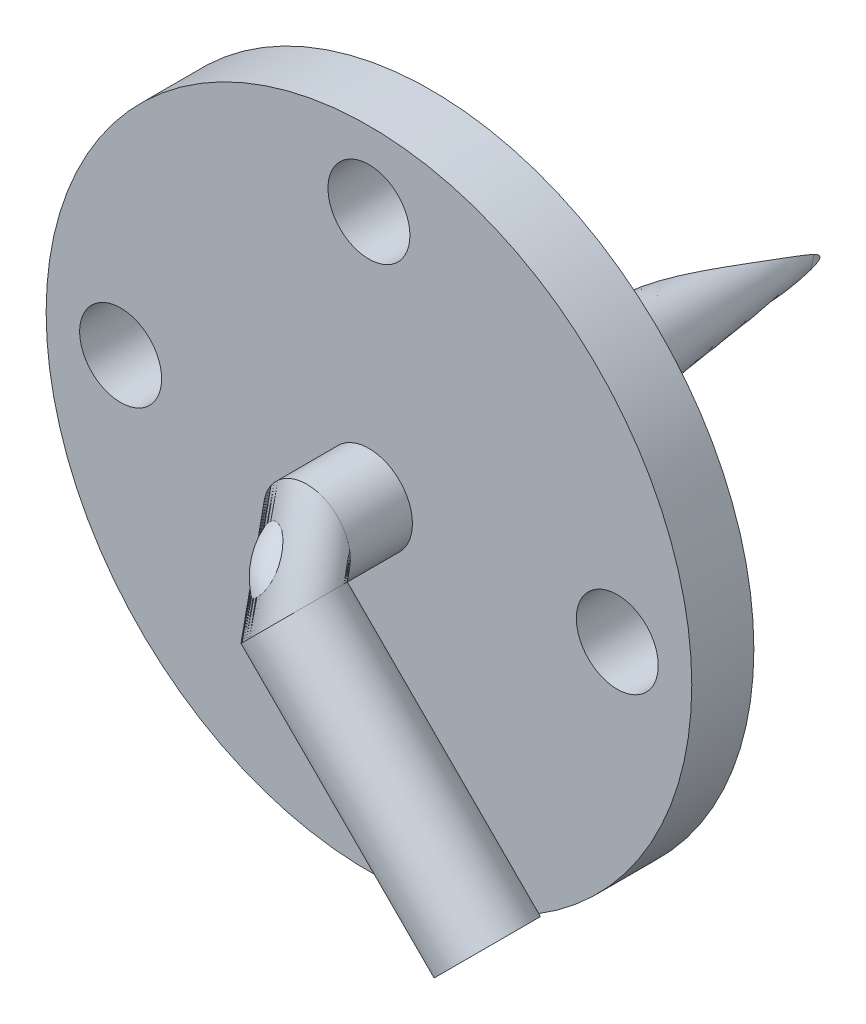
ISO-10303-21;
HEADER;
FILE_DESCRIPTION(('STEP AP214'),'2;1');
FILE_NAME('part.step','',(''),(''),'','','');
FILE_SCHEMA(('AUTOMOTIVE_DESIGN { 1 0 10303 214 1 1 1 1 }'));
ENDSEC;
DATA;
#1=APPLICATION_CONTEXT('core data for automotive mechanical design processes');
#2=APPLICATION_PROTOCOL_DEFINITION('international standard','automotive_design',2000,#1);
#3=PRODUCT_CONTEXT('',#1,'mechanical');
#4=PRODUCT('Part','Part','',(#3));
#5=PRODUCT_RELATED_PRODUCT_CATEGORY('part','',(#4));
#6=PRODUCT_DEFINITION_FORMATION('','',#4);
#7=PRODUCT_DEFINITION_CONTEXT('part definition',#1,'design');
#8=PRODUCT_DEFINITION('design','',#6,#7);
#9=PRODUCT_DEFINITION_SHAPE('','',#8);
#10=(LENGTH_UNIT() NAMED_UNIT(*) SI_UNIT(.MILLI.,.METRE.));
#11=(NAMED_UNIT(*) PLANE_ANGLE_UNIT() SI_UNIT($,.RADIAN.));
#12=(NAMED_UNIT(*) SI_UNIT($,.STERADIAN.) SOLID_ANGLE_UNIT());
#13=UNCERTAINTY_MEASURE_WITH_UNIT(LENGTH_MEASURE(1.E-05),#10,'distance_accuracy_value','');
#14=(GEOMETRIC_REPRESENTATION_CONTEXT(3) GLOBAL_UNCERTAINTY_ASSIGNED_CONTEXT((#13)) GLOBAL_UNIT_ASSIGNED_CONTEXT((#10,
#11,#12)) REPRESENTATION_CONTEXT('',''));
#15=CARTESIAN_POINT('',(0.,0.,0.));
#16=DIRECTION('',(0.,0.,1.));
#17=DIRECTION('',(1.,0.,0.));
#18=AXIS2_PLACEMENT_3D('',#15,#16,#17);
#19=CARTESIAN_POINT('',(0.,0.,2.5));
#20=DIRECTION('',(0.,0.,1.));
#21=DIRECTION('',(1.,0.,0.));
#22=AXIS2_PLACEMENT_3D('',#19,#20,#21);
#23=PLANE('',#22);
#24=CARTESIAN_POINT('',(10.,0.,2.5));
#25=DIRECTION('',(0.,0.,1.));
#26=DIRECTION('',(1.,0.,0.));
#27=AXIS2_PLACEMENT_3D('',#24,#25,#26);
#28=CIRCLE('',#27,1.65);
#29=CARTESIAN_POINT('',(11.65,0.,2.5));
#30=VERTEX_POINT('',#29);
#31=EDGE_CURVE('E66',#30,#30,#28,.T.);
#32=ORIENTED_EDGE('',*,*,#31,.F.);
#33=EDGE_LOOP('',(#32));
#34=FACE_BOUND('',#33,.T.);
#35=CARTESIAN_POINT('',(-10.,0.,2.5));
#36=DIRECTION('',(0.,0.,1.));
#37=DIRECTION('',(1.,0.,0.));
#38=AXIS2_PLACEMENT_3D('',#35,#36,#37);
#39=CIRCLE('',#38,1.65);
#40=CARTESIAN_POINT('',(-8.35,0.,2.5));
#41=VERTEX_POINT('',#40);
#42=EDGE_CURVE('E84',#41,#41,#39,.T.);
#43=ORIENTED_EDGE('',*,*,#42,.F.);
#44=EDGE_LOOP('',(#43));
#45=FACE_BOUND('',#44,.T.);
#46=CARTESIAN_POINT('',(0.,-10.,2.5));
#47=DIRECTION('',(0.,0.,1.));
#48=DIRECTION('',(1.,0.,0.));
#49=AXIS2_PLACEMENT_3D('',#46,#47,#48);
#50=CIRCLE('',#49,1.65);
#51=CARTESIAN_POINT('',(1.65,-10.,2.5));
#52=VERTEX_POINT('',#51);
#53=EDGE_CURVE('E94',#52,#52,#50,.T.);
#54=ORIENTED_EDGE('',*,*,#53,.F.);
#55=EDGE_LOOP('',(#54));
#56=FACE_BOUND('',#55,.T.);
#57=CARTESIAN_POINT('',(0.,0.,2.5));
#58=DIRECTION('',(0.,0.,1.));
#59=DIRECTION('',(1.,0.,0.));
#60=AXIS2_PLACEMENT_3D('',#57,#58,#59);
#61=CIRCLE('',#60,13.);
#62=CARTESIAN_POINT('',(13.,0.,2.5));
#63=VERTEX_POINT('',#62);
#64=EDGE_CURVE('E55',#63,#63,#61,.T.);
#65=ORIENTED_EDGE('',*,*,#64,.T.);
#66=EDGE_LOOP('',(#65));
#67=FACE_BOUND('',#66,.T.);
#68=CARTESIAN_POINT('',(0.,10.,2.5));
#69=DIRECTION('',(0.,0.,1.));
#70=DIRECTION('',(1.,0.,0.));
#71=AXIS2_PLACEMENT_3D('',#68,#69,#70);
#72=CIRCLE('',#71,1.65);
#73=CARTESIAN_POINT('',(1.65,10.,2.5));
#74=VERTEX_POINT('',#73);
#75=EDGE_CURVE('E80',#74,#74,#72,.T.);
#76=ORIENTED_EDGE('',*,*,#75,.F.);
#77=EDGE_LOOP('',(#76));
#78=FACE_BOUND('',#77,.T.);
#79=CARTESIAN_POINT('',(0.,0.,2.5));
#80=DIRECTION('',(0.,0.,1.));
#81=DIRECTION('',(1.,0.,0.));
#82=AXIS2_PLACEMENT_3D('',#79,#80,#81);
#83=CIRCLE('',#82,1.75);
#84=CARTESIAN_POINT('',(1.75,0.,2.5));
#85=VERTEX_POINT('',#84);
#86=EDGE_CURVE('E64',#85,#85,#83,.T.);
#87=ORIENTED_EDGE('',*,*,#86,.F.);
#88=EDGE_LOOP('',(#87));
#89=FACE_BOUND('',#88,.T.);
#90=ADVANCED_FACE('F39',(#34,#45,#56,#67,#78,#89),#23,.T.);
#91=CARTESIAN_POINT('',(0.,0.,0.));
#92=DIRECTION('',(0.,0.,1.));
#93=DIRECTION('',(1.,0.,0.));
#94=AXIS2_PLACEMENT_3D('',#91,#92,#93);
#95=PLANE('',#94);
#96=CARTESIAN_POINT('',(0.,0.,0.));
#97=DIRECTION('',(0.,0.,1.));
#98=DIRECTION('',(1.,0.,0.));
#99=AXIS2_PLACEMENT_3D('',#96,#97,#98);
#100=CIRCLE('',#99,2.5);
#101=CARTESIAN_POINT('',(2.5,0.,0.));
#102=VERTEX_POINT('',#101);
#103=EDGE_CURVE('E11',#102,#102,#100,.F.);
#104=ORIENTED_EDGE('',*,*,#103,.F.);
#105=EDGE_LOOP('',(#104));
#106=FACE_BOUND('',#105,.T.);
#107=CARTESIAN_POINT('',(0.,0.,0.));
#108=DIRECTION('',(0.,0.,1.));
#109=DIRECTION('',(1.,0.,0.));
#110=AXIS2_PLACEMENT_3D('',#107,#108,#109);
#111=CIRCLE('',#110,13.);
#112=CARTESIAN_POINT('',(13.,0.,0.));
#113=VERTEX_POINT('',#112);
#114=EDGE_CURVE('E93',#113,#113,#111,.T.);
#115=ORIENTED_EDGE('',*,*,#114,.F.);
#116=EDGE_LOOP('',(#115));
#117=FACE_BOUND('',#116,.T.);
#118=CARTESIAN_POINT('',(0.,-10.,0.));
#119=DIRECTION('',(0.,0.,1.));
#120=DIRECTION('',(1.,0.,0.));
#121=AXIS2_PLACEMENT_3D('',#118,#119,#120);
#122=CIRCLE('',#121,1.65);
#123=CARTESIAN_POINT('',(1.65,-10.,0.));
#124=VERTEX_POINT('',#123);
#125=EDGE_CURVE('E92',#124,#124,#122,.T.);
#126=ORIENTED_EDGE('',*,*,#125,.T.);
#127=EDGE_LOOP('',(#126));
#128=FACE_BOUND('',#127,.T.);
#129=CARTESIAN_POINT('',(-10.,0.,0.));
#130=DIRECTION('',(0.,0.,1.));
#131=DIRECTION('',(1.,0.,0.));
#132=AXIS2_PLACEMENT_3D('',#129,#130,#131);
#133=CIRCLE('',#132,1.65);
#134=CARTESIAN_POINT('',(-8.35,0.,0.));
#135=VERTEX_POINT('',#134);
#136=EDGE_CURVE('E78',#135,#135,#133,.T.);
#137=ORIENTED_EDGE('',*,*,#136,.T.);
#138=EDGE_LOOP('',(#137));
#139=FACE_BOUND('',#138,.T.);
#140=CARTESIAN_POINT('',(0.,10.,0.));
#141=DIRECTION('',(0.,0.,1.));
#142=DIRECTION('',(1.,0.,0.));
#143=AXIS2_PLACEMENT_3D('',#140,#141,#142);
#144=CIRCLE('',#143,1.65);
#145=CARTESIAN_POINT('',(1.65,10.,0.));
#146=VERTEX_POINT('',#145);
#147=EDGE_CURVE('E73',#146,#146,#144,.T.);
#148=ORIENTED_EDGE('',*,*,#147,.T.);
#149=EDGE_LOOP('',(#148));
#150=FACE_BOUND('',#149,.T.);
#151=CARTESIAN_POINT('',(10.,0.,0.));
#152=DIRECTION('',(0.,0.,1.));
#153=DIRECTION('',(1.,0.,0.));
#154=AXIS2_PLACEMENT_3D('',#151,#152,#153);
#155=CIRCLE('',#154,1.65);
#156=CARTESIAN_POINT('',(11.65,0.,0.));
#157=VERTEX_POINT('',#156);
#158=EDGE_CURVE('E65',#157,#157,#155,.T.);
#159=ORIENTED_EDGE('',*,*,#158,.T.);
#160=EDGE_LOOP('',(#159));
#161=FACE_BOUND('',#160,.T.);
#162=ADVANCED_FACE('F104',(#106,#117,#128,#139,#150,#161),#95,.F.);
#163=CARTESIAN_POINT('',(0.,0.,2.5));
#164=DIRECTION('',(0.,0.,-1.));
#165=DIRECTION('',(-1.,0.,0.));
#166=AXIS2_PLACEMENT_3D('',#163,#164,#165);
#167=CYLINDRICAL_SURFACE('',#166,13.);
#168=ORIENTED_EDGE('',*,*,#64,.F.);
#169=EDGE_LOOP('',(#168));
#170=FACE_BOUND('',#169,.T.);
#171=ORIENTED_EDGE('',*,*,#114,.T.);
#172=EDGE_LOOP('',(#171));
#173=FACE_BOUND('',#172,.T.);
#174=ADVANCED_FACE('F41',(#170,#173),#167,.T.);
#175=CARTESIAN_POINT('',(0.,-10.,2.5));
#176=DIRECTION('',(0.,0.,-1.));
#177=DIRECTION('',(-1.,0.,0.));
#178=AXIS2_PLACEMENT_3D('',#175,#176,#177);
#179=CYLINDRICAL_SURFACE('',#178,1.65);
#180=ORIENTED_EDGE('',*,*,#53,.T.);
#181=EDGE_LOOP('',(#180));
#182=FACE_BOUND('',#181,.T.);
#183=ORIENTED_EDGE('',*,*,#125,.F.);
#184=EDGE_LOOP('',(#183));
#185=FACE_BOUND('',#184,.T.);
#186=ADVANCED_FACE('F138',(#182,#185),#179,.F.);
#187=CARTESIAN_POINT('',(0.,0.,2.5));
#188=DIRECTION('',(0.,0.,-1.));
#189=DIRECTION('',(-1.,0.,0.));
#190=AXIS2_PLACEMENT_3D('',#187,#188,#189);
#191=CYLINDRICAL_SURFACE('',#190,1.);
#192=CARTESIAN_POINT('',(0.,0.,0.));
#193=DIRECTION('',(0.,0.,1.));
#194=DIRECTION('',(1.,0.,0.));
#195=AXIS2_PLACEMENT_3D('',#192,#193,#194);
#196=CIRCLE('',#195,1.);
#197=CARTESIAN_POINT('',(1.,0.,0.));
#198=VERTEX_POINT('',#197);
#199=EDGE_CURVE('E86',#198,#198,#196,.T.);
#200=ORIENTED_EDGE('',*,*,#199,.F.);
#201=EDGE_LOOP('',(#200));
#202=FACE_BOUND('',#201,.T.);
#203=CARTESIAN_POINT('',(0.,0.,5.));
#204=DIRECTION('',(0.,0.,1.));
#205=DIRECTION('',(1.,0.,0.));
#206=AXIS2_PLACEMENT_3D('',#203,#204,#205);
#207=CIRCLE('',#206,1.);
#208=CARTESIAN_POINT('',(-0.707106781186548,0.707106781186548,5.));
#209=VERTEX_POINT('',#208);
#210=EDGE_CURVE('E67',#209,#209,#207,.T.);
#211=ORIENTED_EDGE('',*,*,#210,.T.);
#212=EDGE_LOOP('',(#211));
#213=FACE_BOUND('',#212,.T.);
#214=ADVANCED_FACE('F141',(#202,#213),#191,.F.);
#215=CARTESIAN_POINT('',(-10.,0.,2.5));
#216=DIRECTION('',(0.,0.,-1.));
#217=DIRECTION('',(-1.,0.,0.));
#218=AXIS2_PLACEMENT_3D('',#215,#216,#217);
#219=CYLINDRICAL_SURFACE('',#218,1.65);
#220=ORIENTED_EDGE('',*,*,#42,.T.);
#221=EDGE_LOOP('',(#220));
#222=FACE_BOUND('',#221,.T.);
#223=ORIENTED_EDGE('',*,*,#136,.F.);
#224=EDGE_LOOP('',(#223));
#225=FACE_BOUND('',#224,.T.);
#226=ADVANCED_FACE('F126',(#222,#225),#219,.F.);
#227=CARTESIAN_POINT('',(0.,10.,2.5));
#228=DIRECTION('',(0.,0.,-1.));
#229=DIRECTION('',(-1.,0.,0.));
#230=AXIS2_PLACEMENT_3D('',#227,#228,#229);
#231=CYLINDRICAL_SURFACE('',#230,1.65);
#232=ORIENTED_EDGE('',*,*,#75,.T.);
#233=EDGE_LOOP('',(#232));
#234=FACE_BOUND('',#233,.T.);
#235=ORIENTED_EDGE('',*,*,#147,.F.);
#236=EDGE_LOOP('',(#235));
#237=FACE_BOUND('',#236,.T.);
#238=ADVANCED_FACE('F118',(#234,#237),#231,.F.);
#239=CARTESIAN_POINT('',(10.,0.,2.5));
#240=DIRECTION('',(0.,0.,-1.));
#241=DIRECTION('',(-1.,0.,0.));
#242=AXIS2_PLACEMENT_3D('',#239,#240,#241);
#243=CYLINDRICAL_SURFACE('',#242,1.65);
#244=ORIENTED_EDGE('',*,*,#31,.T.);
#245=EDGE_LOOP('',(#244));
#246=FACE_BOUND('',#245,.T.);
#247=ORIENTED_EDGE('',*,*,#158,.F.);
#248=EDGE_LOOP('',(#247));
#249=FACE_BOUND('',#248,.T.);
#250=ADVANCED_FACE('F116',(#246,#249),#243,.F.);
#251=CARTESIAN_POINT('',(0.,0.,5.));
#252=DIRECTION('',(0.,0.,-1.));
#253=DIRECTION('',(-1.,0.,0.));
#254=AXIS2_PLACEMENT_3D('',#251,#252,#253);
#255=CYLINDRICAL_SURFACE('',#254,1.75);
#256=CARTESIAN_POINT('',(0.,0.,5.));
#257=DIRECTION('',(0.,0.,1.));
#258=DIRECTION('',(1.,0.,0.));
#259=AXIS2_PLACEMENT_3D('',#256,#257,#258);
#260=CIRCLE('',#259,1.75);
#261=CARTESIAN_POINT('',(1.23743686707646,-1.23743686707646,5.));
#262=VERTEX_POINT('',#261);
#263=EDGE_CURVE('E60',#262,#262,#260,.T.);
#264=ORIENTED_EDGE('',*,*,#263,.F.);
#265=EDGE_LOOP('',(#264));
#266=FACE_BOUND('',#265,.T.);
#267=ORIENTED_EDGE('',*,*,#86,.T.);
#268=EDGE_LOOP('',(#267));
#269=FACE_BOUND('',#268,.T.);
#270=ADVANCED_FACE('F117',(#266,#269),#255,.T.);
#271=CARTESIAN_POINT('',(1.23743686707646,-1.23743686707646,5.));
#272=DIRECTION('',(0.707106781186547,0.707106781186548,0.));
#273=DIRECTION('',(-0.707106781186548,0.707106781186547,0.));
#274=AXIS2_PLACEMENT_3D('',#271,#272,#273);
#275=TOROIDAL_SURFACE('',#274,1.75,1.75);
#276=CARTESIAN_POINT('',(1.23743686707646,-1.23743686707646,6.75));
#277=DIRECTION('',(0.707106781186548,-0.707106781186547,0.));
#278=DIRECTION('',(0.5,0.5,-0.707106781186548));
#279=AXIS2_PLACEMENT_3D('',#276,#277,#278);
#280=CIRCLE('',#279,1.75);
#281=EDGE_CURVE('E58',#262,#262,#280,.T.);
#282=ORIENTED_EDGE('',*,*,#281,.F.);
#283=ORIENTED_EDGE('',*,*,#263,.T.);
#284=EDGE_LOOP('',(#282,#283));
#285=FACE_BOUND('',#284,.T.);
#286=ADVANCED_FACE('F59',(#285),#275,.T.);
#287=CARTESIAN_POINT('',(1.23743686707646,-1.23743686707646,6.75));
#288=DIRECTION('',(0.707106781186548,-0.707106781186547,0.));
#289=DIRECTION('',(0.707106781186547,0.707106781186548,0.));
#290=AXIS2_PLACEMENT_3D('',#287,#288,#289);
#291=CYLINDRICAL_SURFACE('',#290,1.75);
#292=ORIENTED_EDGE('',*,*,#281,.T.);
#293=EDGE_LOOP('',(#292));
#294=FACE_BOUND('',#293,.T.);
#295=CARTESIAN_POINT('',(9.01561146012848,-9.01561146012848,6.75));
#296=DIRECTION('',(0.707106781186548,-0.707106781186547,0.));
#297=DIRECTION('',(0.707106781186547,0.707106781186548,0.));
#298=AXIS2_PLACEMENT_3D('',#295,#296,#297);
#299=CIRCLE('',#298,1.75);
#300=CARTESIAN_POINT('',(10.2530483272049,-7.77817459305202,6.75));
#301=VERTEX_POINT('',#300);
#302=EDGE_CURVE('E326',#301,#301,#299,.T.);
#303=ORIENTED_EDGE('',*,*,#302,.F.);
#304=EDGE_LOOP('',(#303));
#305=FACE_BOUND('',#304,.T.);
#306=ADVANCED_FACE('F214',(#294,#305),#291,.T.);
#307=CARTESIAN_POINT('',(1.23743686707646,-1.23743686707646,5.));
#308=DIRECTION('',(0.707106781186547,0.707106781186548,0.));
#309=DIRECTION('',(-0.707106781186548,0.707106781186547,0.));
#310=AXIS2_PLACEMENT_3D('',#307,#308,#309);
#311=TOROIDAL_SURFACE('',#310,1.75,1.);
#312=CARTESIAN_POINT('',(1.23743686707646,-1.23743686707646,6.75));
#313=DIRECTION('',(0.707106781186548,-0.707106781186547,0.));
#314=DIRECTION('',(0.5,0.5,-0.707106781186548));
#315=AXIS2_PLACEMENT_3D('',#312,#313,#314);
#316=CIRCLE('',#315,1.);
#317=CARTESIAN_POINT('',(1.23743686707646,-1.23743686707646,7.75));
#318=VERTEX_POINT('',#317);
#319=EDGE_CURVE('E327',#318,#318,#316,.F.);
#320=CARTESIAN_POINT('',(1.23743686707646,-1.23743686707646,5.));
#321=DIRECTION('',(0.707106781186547,0.707106781186548,0.));
#322=DIRECTION('',(-0.707106781186548,0.707106781186547,0.));
#323=AXIS2_PLACEMENT_3D('',#320,#321,#322);
#324=CIRCLE('',#323,2.75);
#325=EDGE_CURVE('',#209,#318,#324,.T.);
#326=ORIENTED_EDGE('',*,*,#210,.F.);
#327=ORIENTED_EDGE('',*,*,#319,.F.);
#328=ORIENTED_EDGE('',*,*,#325,.T.);
#329=ORIENTED_EDGE('',*,*,#325,.F.);
#330=EDGE_LOOP('',(#326,#328,#327,#329));
#331=FACE_BOUND('',#330,.T.);
#332=ADVANCED_FACE('F224',(#331),#311,.F.);
#333=CARTESIAN_POINT('',(1.23743686707646,-1.23743686707646,6.75));
#334=DIRECTION('',(0.707106781186548,-0.707106781186547,0.));
#335=DIRECTION('',(0.707106781186547,0.707106781186548,0.));
#336=AXIS2_PLACEMENT_3D('',#333,#334,#335);
#337=CYLINDRICAL_SURFACE('',#336,1.);
#338=ORIENTED_EDGE('',*,*,#319,.T.);
#339=EDGE_LOOP('',(#338));
#340=FACE_BOUND('',#339,.T.);
#341=CARTESIAN_POINT('',(9.01561146012848,-9.01561146012848,6.75));
#342=DIRECTION('',(0.707106781186548,-0.707106781186547,0.));
#343=DIRECTION('',(0.707106781186547,0.707106781186548,0.));
#344=AXIS2_PLACEMENT_3D('',#341,#342,#343);
#345=CIRCLE('',#344,1.);
#346=CARTESIAN_POINT('',(9.72271824131503,-8.30850467894193,6.75));
#347=VERTEX_POINT('',#346);
#348=EDGE_CURVE('E324',#347,#347,#345,.T.);
#349=ORIENTED_EDGE('',*,*,#348,.T.);
#350=EDGE_LOOP('',(#349));
#351=FACE_BOUND('',#350,.T.);
#352=ADVANCED_FACE('F129',(#340,#351),#337,.F.);
#353=CARTESIAN_POINT('',(9.01561146012848,-9.01561146012848,6.75));
#354=DIRECTION('',(0.707106781186548,-0.707106781186547,0.));
#355=DIRECTION('',(0.707106781186547,0.707106781186548,0.));
#356=AXIS2_PLACEMENT_3D('',#353,#354,#355);
#357=PLANE('',#356);
#358=ORIENTED_EDGE('',*,*,#302,.T.);
#359=EDGE_LOOP('',(#358));
#360=FACE_BOUND('',#359,.T.);
#361=ORIENTED_EDGE('',*,*,#348,.F.);
#362=EDGE_LOOP('',(#361));
#363=FACE_BOUND('',#362,.T.);
#364=ADVANCED_FACE('F213',(#360,#363),#357,.T.);
#365=CARTESIAN_POINT('',(0.,0.,0.));
#366=DIRECTION('',(0.,0.,-1.));
#367=DIRECTION('',(-1.,0.,0.));
#368=AXIS2_PLACEMENT_3D('',#365,#366,#367);
#369=PLANE('',#368);
#370=CARTESIAN_POINT('',(0.,0.,0.));
#371=DIRECTION('',(0.,0.,-1.));
#372=DIRECTION('',(-1.,0.,0.));
#373=AXIS2_PLACEMENT_3D('',#370,#371,#372);
#374=CIRCLE('',#373,0.5);
#375=CARTESIAN_POINT('',(-0.5,0.,0.));
#376=VERTEX_POINT('',#375);
#377=EDGE_CURVE('E316',#376,#376,#374,.T.);
#378=ORIENTED_EDGE('',*,*,#377,.T.);
#379=EDGE_LOOP('',(#378));
#380=FACE_BOUND('',#379,.T.);
#381=ORIENTED_EDGE('',*,*,#199,.T.);
#382=EDGE_LOOP('',(#381));
#383=FACE_BOUND('',#382,.T.);
#384=ADVANCED_FACE('F248',(#380,#383),#369,.F.);
#385=CARTESIAN_POINT('',(0.,0.,0.));
#386=DIRECTION('',(0.,0.,1.));
#387=DIRECTION('',(-1.,0.,0.));
#388=AXIS2_PLACEMENT_3D('',#385,#386,#387);
#389=CONICAL_SURFACE('',#388,2.5,0.122173047639603);
#390=CARTESIAN_POINT('',(0.650387906013212,-0.261293150512693,-14.6523906522866));
#391=CARTESIAN_POINT('',(0.651309016383526,-0.251019470734047,-14.6765999202653));
#392=CARTESIAN_POINT('',(0.652146807185103,-0.240450651162205,-14.7006877978996));
#393=CARTESIAN_POINT('',(0.653659033565699,-0.21843687886842,-14.7485314101537));
#394=CARTESIAN_POINT('',(0.654333143237079,-0.206990236942591,-14.7722863947996));
#395=CARTESIAN_POINT('',(0.655512823742619,-0.182938777542622,-14.8189483161456));
#396=CARTESIAN_POINT('',(0.656019779189036,-0.170344637924219,-14.8418607470382));
#397=CARTESIAN_POINT('',(0.656874935486865,-0.143208343787394,-14.8864877573539));
#398=CARTESIAN_POINT('',(0.657223728072893,-0.128673718021874,-14.9082065299037));
#399=CARTESIAN_POINT('',(0.657621135729844,-0.104803634988457,-14.9377067362055));
#400=CARTESIAN_POINT('',(0.65772989791494,-0.0969316436804664,-14.9466513886908));
#401=CARTESIAN_POINT('',(0.657915970052388,-0.0800948873669221,-14.9634418557019));
#402=CARTESIAN_POINT('',(0.657993413339822,-0.0711349707011022,-14.9712922332429));
#403=CARTESIAN_POINT('',(0.658085966079111,-0.0566186944127039,-14.9815264849003));
#404=CARTESIAN_POINT('',(0.658112854468826,-0.0516104606362154,-14.9846767453726));
#405=CARTESIAN_POINT('',(0.658158708354126,-0.0412029886975293,-14.9902665099768));
#406=CARTESIAN_POINT('',(0.658177675845747,-0.0358038494449176,-14.9927061931244));
#407=CARTESIAN_POINT('',(0.658207571781146,-0.0245745052499262,-14.9966570720991));
#408=CARTESIAN_POINT('',(0.658218378882825,-0.0187391598920174,-14.9981542002416));
#409=CARTESIAN_POINT('',(0.658231101220235,-0.0068887536743733,-14.9999258664716));
#410=CARTESIAN_POINT('',(0.658233035141072,-0.000874097332935209,-15.0002029736243));
#411=CARTESIAN_POINT('',(0.658228361348984,0.0101703264853276,-14.9995465090122));
#412=CARTESIAN_POINT('',(0.65822299917715,0.0152116877027437,-14.9987894101607));
#413=CARTESIAN_POINT('',(0.658206009559098,0.0251038620739108,-14.9964622599377));
#414=CARTESIAN_POINT('',(0.658194374119505,0.0299544236323272,-14.9948911714835));
#415=CARTESIAN_POINT('',(0.658158130009014,0.0416087517704876,-14.9901944972787));
#416=CARTESIAN_POINT('',(0.658129991558814,0.0482556364164764,-14.9866852528373));
#417=CARTESIAN_POINT('',(0.658061145571779,0.0609390805887943,-14.9787033998282));
#418=CARTESIAN_POINT('',(0.658020403220784,0.0669738873705726,-14.9742281334186));
#419=CARTESIAN_POINT('',(0.657854218295116,0.0874068357315273,-14.9573134484545));
#420=CARTESIAN_POINT('',(0.657694882793086,0.100392219559889,-14.9432114797376));
#421=CARTESIAN_POINT('',(0.657294423327989,0.124409029223051,-14.913423642597));
#422=CARTESIAN_POINT('',(0.657052692534431,0.135425005529452,-14.89772664704));
#423=CARTESIAN_POINT('',(0.656167811933674,0.167861776021744,-14.8475813800058));
#424=CARTESIAN_POINT('',(0.655377897212508,0.187158674350497,-14.8117746995833));
#425=CARTESIAN_POINT('',(0.653406461010012,0.223272013169114,-14.738924354305));
#426=CARTESIAN_POINT('',(0.652223730784884,0.24008056296862,-14.7018771927227));
#427=CARTESIAN_POINT('',(0.64945905166448,0.272188330392317,-14.6270889071903));
#428=CARTESIAN_POINT('',(0.647876655740964,0.287485831069207,-14.5893470503379));
#429=CARTESIAN_POINT('',(0.644312637184248,0.317055428355377,-14.5135584686077));
#430=CARTESIAN_POINT('',(0.642331623617928,0.331329044810185,-14.4755122928603));
#431=CARTESIAN_POINT('',(0.635814799851519,0.372898054714668,-14.3615642630053));
#432=CARTESIAN_POINT('',(0.630685637730932,0.399159031235134,-14.285318012336));
#433=CARTESIAN_POINT('',(0.618829458926739,0.449994466242684,-14.1323856745658));
#434=CARTESIAN_POINT('',(0.612102140739253,0.474568605366569,-14.0556995071386));
#435=CARTESIAN_POINT('',(0.589504385026746,0.546493649636655,-13.8251402971434));
#436=CARTESIAN_POINT('',(0.571226729298554,0.591994749126183,-13.6709180432794));
#437=CARTESIAN_POINT('',(0.528283838668413,0.67920259839586,-13.3623356027525));
#438=CARTESIAN_POINT('',(0.503619812213623,0.720910064002793,-13.2079754476843));
#439=CARTESIAN_POINT('',(0.447968052501731,0.800400940877686,-12.8994614031886));
#440=CARTESIAN_POINT('',(0.416983102825132,0.838186068433936,-12.7453074529286));
#441=CARTESIAN_POINT('',(0.329856903129577,0.929084495268066,-12.3520637375853));
#442=CARTESIAN_POINT('',(0.269287071654263,0.979097856801279,-12.1132152946747));
#443=CARTESIAN_POINT('',(0.133371285525503,1.06548691112175,-11.6368623306773));
#444=CARTESIAN_POINT('',(0.0580087132332364,1.10184713139628,-11.3993596329453));
#445=CARTESIAN_POINT('',(-0.0655226926030483,1.14268292265503,-11.0450951437523));
#446=CARTESIAN_POINT('',(-0.108473680555814,1.15401316378588,-10.9272757394769));
#447=CARTESIAN_POINT('',(-0.197720282443655,1.17133651410907,-10.6925244897944));
#448=CARTESIAN_POINT('',(-0.244015180588394,1.17733076187397,-10.5755924603251));
#449=CARTESIAN_POINT('',(-0.33967404944516,1.18308331754255,-10.3430684118314));
#450=CARTESIAN_POINT('',(-0.389032352587538,1.18285281774017,-10.2274743615677));
#451=CARTESIAN_POINT('',(-0.490597090297115,1.17506094530101,-9.99782385772651));
#452=CARTESIAN_POINT('',(-0.542802241324041,1.16750285103822,-9.88376673966075));
#453=CARTESIAN_POINT('',(-0.643048536224046,1.14507968984862,-9.67169268278067));
#454=CARTESIAN_POINT('',(-0.690806169463315,1.13123390718982,-9.57343652222805));
#455=CARTESIAN_POINT('',(-0.787821554909635,1.09547716762174,-9.37898603132608));
#456=CARTESIAN_POINT('',(-0.837080687575383,1.07355857015082,-9.28279374591409));
#457=CARTESIAN_POINT('',(-0.935938772350111,1.02014380028781,-9.09433733634352));
#458=CARTESIAN_POINT('',(-0.985531249335126,0.988730854695367,-9.00204671888797));
#459=CARTESIAN_POINT('',(-1.08425204514736,0.913960251866891,-8.82228397209314));
#460=CARTESIAN_POINT('',(-1.13338123198842,0.870633655589436,-8.7348000130028));
#461=CARTESIAN_POINT('',(-1.21432537007848,0.784428448352952,-8.59337871802777));
#462=CARTESIAN_POINT('',(-1.24680676888463,0.745533624738107,-8.53741712923709));
#463=CARTESIAN_POINT('',(-1.30926312357224,0.658982939237969,-8.43106640644261));
#464=CARTESIAN_POINT('',(-1.33924257682533,0.611343312505602,-8.38066721873512));
#465=CARTESIAN_POINT('',(-1.38490151062152,0.524286427080609,-8.30463831071151));
#466=CARTESIAN_POINT('',(-1.40192434395454,0.487786262150126,-8.27649613691174));
#467=CARTESIAN_POINT('',(-1.43307996711635,0.410252010503865,-8.2252558022762));
#468=CARTESIAN_POINT('',(-1.44721660843706,0.369224080089959,-8.20215091657569));
#469=CARTESIAN_POINT('',(-1.46908124415488,0.291412705856396,-8.16654716498059));
#470=CARTESIAN_POINT('',(-1.47752288351397,0.255382106629539,-8.15285600179217));
#471=CARTESIAN_POINT('',(-1.49117916261805,0.181146224260535,-8.1307487769891));
#472=CARTESIAN_POINT('',(-1.49639679643275,0.142942994919654,-8.12232782094443));
#473=CARTESIAN_POINT('',(-1.50313757587494,0.0651244258958922,-8.11145446854293));
#474=CARTESIAN_POINT('',(-1.50463900238665,0.0255021513469285,-8.10903715980603));
#475=CARTESIAN_POINT('',(-1.50371878330817,-0.0535783415055934,-8.11051999594697));
#476=CARTESIAN_POINT('',(-1.50129701966295,-0.093036554836467,-8.11442033093276));
#477=CARTESIAN_POINT('',(-1.49316811801867,-0.167059122969179,-8.1275411401092));
#478=CARTESIAN_POINT('',(-1.48776806812217,-0.201749001649764,-8.13626449849974));
#479=CARTESIAN_POINT('',(-1.4743415179279,-0.269197420776583,-8.15801638308727));
#480=CARTESIAN_POINT('',(-1.46631401444384,-0.301955217889129,-8.17104655368405));
#481=CARTESIAN_POINT('',(-1.44371178846385,-0.380434777655768,-8.20787003160349));
#482=CARTESIAN_POINT('',(-1.4278478595702,-0.424770353086465,-8.233821576222));
#483=CARTESIAN_POINT('',(-1.3928486418984,-0.50807593074365,-8.29148237061255));
#484=CARTESIAN_POINT('',(-1.37370517657926,-0.54703207157783,-8.32320602398754));
#485=CARTESIAN_POINT('',(-1.32120508872078,-0.641630369449194,-8.41091783577854));
#486=CARTESIAN_POINT('',(-1.28618201310762,-0.69336391793295,-8.47009176723839));
#487=CARTESIAN_POINT('',(-1.21348988164656,-0.786130807695057,-8.59478236430187));
#488=CARTESIAN_POINT('',(-1.17581446344769,-0.827137224573634,-8.66031443442266));
#489=CARTESIAN_POINT('',(-1.10236480611031,-0.897494437029448,-8.79018642554416));
#490=CARTESIAN_POINT('',(-1.06667098582318,-0.92750421678762,-8.85422178760056));
#491=CARTESIAN_POINT('',(-0.995058171886101,-0.981259909280764,-8.98478439799663));
#492=CARTESIAN_POINT('',(-0.959139012239458,-1.00500046113873,-9.05131372379945));
#493=CARTESIAN_POINT('',(-0.887536584556996,-1.0471499097541,-9.18622179168705));
#494=CARTESIAN_POINT('',(-0.851853554715637,-1.06555404612998,-9.25460212589598));
#495=CARTESIAN_POINT('',(-0.78105547081754,-1.09774055357765,-9.39274265654153));
#496=CARTESIAN_POINT('',(-0.745940631283894,-1.11152121607731,-9.46250335301863));
#497=CARTESIAN_POINT('',(-0.643155979712761,-1.14636769014609,-9.67062378860226));
#498=CARTESIAN_POINT('',(-0.57661476785983,-1.16171624357207,-9.81051053395141));
#499=CARTESIAN_POINT('',(-0.447627552840704,-1.18026096784588,-10.0930078053753));
#500=CARTESIAN_POINT('',(-0.385185969123342,-1.18344422910217,-10.2356210636362));
#501=CARTESIAN_POINT('',(-0.264823329792375,-1.1799337945431,-10.523210263678));
#502=CARTESIAN_POINT('',(-0.20691975478357,-1.17320370950521,-10.668192968664));
#503=CARTESIAN_POINT('',(-0.09632080549865,-1.15157057305531,-10.9593794250015));
#504=CARTESIAN_POINT('',(-0.0436217091142248,-1.13667341321419,-11.1055822214207));
#505=CARTESIAN_POINT('',(0.0541370830958068,-1.10089228755892,-11.3924477095338));
#506=CARTESIAN_POINT('',(0.0994322102353932,-1.08030382696679,-11.5330678340193));
#507=CARTESIAN_POINT('',(0.184920409293975,-1.03387808415988,-11.8149930786957));
#508=CARTESIAN_POINT('',(0.225113129112026,-1.00804044003517,-11.9562982454613));
#509=CARTESIAN_POINT('',(0.300382736486898,-0.951823812017219,-12.2398068518792));
#510=CARTESIAN_POINT('',(0.335444736808649,-0.921432111082135,-12.38201170352));
#511=CARTESIAN_POINT('',(0.400220013609528,-0.856803610540435,-12.6667199680805));
#512=CARTESIAN_POINT('',(0.42993471677455,-0.822567840521387,-12.8092232910711));
#513=CARTESIAN_POINT('',(0.484003472988701,-0.750635000648714,-13.0946092432913));
#514=CARTESIAN_POINT('',(0.508349241573271,-0.712932707076875,-13.2374921191361));
#515=CARTESIAN_POINT('',(0.551592686197799,-0.634271506811041,-13.5233096281905));
#516=CARTESIAN_POINT('',(0.570486342044053,-0.593310225301824,-13.6662442221749));
#517=CARTESIAN_POINT('',(0.594666246408796,-0.529187012382629,-13.8799525207254));
#518=CARTESIAN_POINT('',(0.602021077407472,-0.507416820070782,-13.9509168133252));
#519=CARTESIAN_POINT('',(0.615369868329885,-0.462750057718416,-14.0926430995504));
#520=CARTESIAN_POINT('',(0.621363483379297,-0.439853204013495,-14.1634050374339));
#521=CARTESIAN_POINT('',(0.631981837133657,-0.392563616359544,-14.3044217119074));
#522=CARTESIAN_POINT('',(0.636608405962694,-0.3681729355924,-14.3746770026326));
#523=CARTESIAN_POINT('',(0.644507820750371,-0.317072742210311,-14.5144087960549));
#524=CARTESIAN_POINT('',(0.647781441348632,-0.290364567121664,-14.5838857221768));
#525=CARTESIAN_POINT('',(0.650387906013212,-0.261293150512693,-14.6523906522866));
#526=B_SPLINE_CURVE_WITH_KNOTS('',3,(#390,#391,#392,#393,#394,#395,#396,#397,#398,#399,#400,
#401,#402,#403,#404,#405,#406,#407,#408,#409,#410,#411,#412,#413,#414,#415,#416,#417,#418,#419,
#420,#421,#422,#423,#424,#425,#426,#427,#428,#429,#430,#431,#432,#433,#434,#435,#436,#437,#438,
#439,#440,#441,#442,#443,#444,#445,#446,#447,#448,#449,#450,#451,#452,#453,#454,#455,#456,#457,
#458,#459,#460,#461,#462,#463,#464,#465,#466,#467,#468,#469,#470,#471,#472,#473,#474,#475,#476,
#477,#478,#479,#480,#481,#482,#483,#484,#485,#486,#487,#488,#489,#490,#491,#492,#493,#494,#495,
#496,#497,#498,#499,#500,#501,#502,#503,#504,#505,#506,#507,#508,#509,#510,#511,#512,#513,#514,
#515,#516,#517,#518,#519,#520,#521,#522,#523,#524,#525),.UNSPECIFIED.,.T.,.F.,(4,2,2,2,2,2,2,2,
2,2,2,2,2,2,2,2,2,2,2,2,2,2,2,2,2,2,2,2,2,2,2,2,2,2,2,2,2,2,2,2,2,2,2,2,2,2,2,2,2,2,2,2,2,2,2,2,
2,2,2,2,2,2,2,2,2,2,2,4),(0.,0.0789441705660483,0.158044262105403,0.236471631948048,
0.314603110355121,0.350301117986312,0.385845505456323,0.403554388885664,0.42125880704667,
0.439221563197492,0.457146476039877,0.472365065551549,0.48760309252093,0.51002281805761,
0.532505032205212,0.58956614624654,0.647056928930484,0.768771249155179,0.890863624663962,
1.01309317063882,1.13513735537883,1.37749399543608,1.61989639421438,2.10518225316199,
2.59037635196452,3.07535724257951,3.82892403757978,4.58334225811198,4.96095779586247,
5.3384927402188,5.71534891001851,6.09203655171441,6.42213777826974,6.75255223725059,
7.08015041016539,7.40690244611858,7.63287011330229,7.85842242733803,8.00540002042409,
8.15218017781647,8.27008463198797,8.38787942542574,8.50636105372607,8.62484624739325,
8.73292961467035,8.84105429741819,9.00143645970641,9.16222446646116,9.41892654086753,
9.67626686943044,9.91356746812108,10.1510703325257,10.3887844155336,10.6265862475926,
11.0928110208832,11.5595304064471,12.0279672680373,12.4960666520747,12.9433617171344,
13.3906876318487,13.8392868057554,14.2877661131074,14.7369326723529,15.1864295896338,
15.4101903245553,15.6340076878598,15.8575240452675,16.0809122489904),.UNSPECIFIED.);
#527=CARTESIAN_POINT('',(0.650387906013212,-0.261293150512693,-14.6523906522866));
#528=VERTEX_POINT('',#527);
#529=EDGE_CURVE('E312',#528,#528,#526,.T.);
#530=ORIENTED_EDGE('',*,*,#529,.T.);
#531=EDGE_LOOP('',(#530));
#532=FACE_BOUND('',#531,.T.);
#533=ORIENTED_EDGE('',*,*,#103,.T.);
#534=EDGE_LOOP('',(#533));
#535=FACE_BOUND('',#534,.T.);
#536=ADVANCED_FACE('F259',(#532,#535),#389,.T.);
#537=CARTESIAN_POINT('',(0.,0.,0.));
#538=DIRECTION('',(0.,0.,-1.));
#539=DIRECTION('',(-1.,0.,0.));
#540=AXIS2_PLACEMENT_3D('',#537,#538,#539);
#541=CYLINDRICAL_SURFACE('',#540,0.5);
#542=CARTESIAN_POINT('',(0.494193805472367,-0.0759768559040746,-13.0192281128357));
#543=CARTESIAN_POINT('',(0.492629708568651,-0.0861561584868214,-13.0102261859376));
#544=CARTESIAN_POINT('',(0.490886111442513,-0.0954472020562682,-13.0002544031024));
#545=CARTESIAN_POINT('',(0.487192583381336,-0.112788382091349,-12.9793063623275));
#546=CARTESIAN_POINT('',(0.485241771318463,-0.120832830080348,-12.9683258440818));
#547=CARTESIAN_POINT('',(0.479128482143801,-0.143853695411301,-12.934213111338));
#548=CARTESIAN_POINT('',(0.474754810338143,-0.157450608549134,-12.9101976820148));
#549=CARTESIAN_POINT('',(0.466071132460029,-0.18144281680396,-12.8633714184473));
#550=CARTESIAN_POINT('',(0.461789039243475,-0.192014149416475,-12.8406390403642));
#551=CARTESIAN_POINT('',(0.452991901235333,-0.211936133340659,-12.7946837367281));
#552=CARTESIAN_POINT('',(0.448476821729076,-0.221286602008131,-12.7714607383795));
#553=CARTESIAN_POINT('',(0.434602525558077,-0.248048395782895,-12.7012223058054));
#554=CARTESIAN_POINT('',(0.424937000055513,-0.264112347514501,-12.6537605088099));
#555=CARTESIAN_POINT('',(0.404926234437393,-0.293854541594889,-12.5584648330131));
#556=CARTESIAN_POINT('',(0.39458370518795,-0.307541582742975,-12.510633042175));
#557=CARTESIAN_POINT('',(0.373236793298462,-0.333123449276927,-12.4147210538283));
#558=CARTESIAN_POINT('',(0.362233406293154,-0.345020880557452,-12.3666413250402));
#559=CARTESIAN_POINT('',(0.334188673311765,-0.372651697788911,-12.247410981029));
#560=CARTESIAN_POINT('',(0.316762223645318,-0.387522317899457,-12.1761511560934));
#561=CARTESIAN_POINT('',(0.280523039282202,-0.414506555658615,-12.0334514538305));
#562=CARTESIAN_POINT('',(0.261710006579081,-0.426619578339668,-11.9620115410036));
#563=CARTESIAN_POINT('',(0.22269047942244,-0.448226791595285,-11.8189513443158));
#564=CARTESIAN_POINT('',(0.202481142084418,-0.457715430056419,-11.7473309966875));
#565=CARTESIAN_POINT('',(0.16073666580276,-0.473988828022036,-11.604169891543));
#566=CARTESIAN_POINT('',(0.139201553633683,-0.480773642110677,-11.5326291324491));
#567=CARTESIAN_POINT('',(0.0949302528621901,-0.491431225581527,-11.3900082144638));
#568=CARTESIAN_POINT('',(0.0721990974314929,-0.495315293471454,-11.3189273489083));
#569=CARTESIAN_POINT('',(0.0255141147315901,-0.499899320634941,-11.1770762990267));
#570=CARTESIAN_POINT('',(0.00156056404427143,-0.500599996987992,-11.1063060483212));
#571=CARTESIAN_POINT('',(-0.0474438428057442,-0.498346811864953,-10.9653786402079));
#572=CARTESIAN_POINT('',(-0.0724920882374667,-0.495401231731852,-10.8952204566179));
#573=CARTESIAN_POINT('',(-0.123614119225562,-0.485181428251557,-10.7556130031991));
#574=CARTESIAN_POINT('',(-0.149687295034468,-0.477909743237875,-10.6861633419323));
#575=CARTESIAN_POINT('',(-0.188753516701033,-0.463196927570717,-10.58454324464));
#576=CARTESIAN_POINT('',(-0.201427317152159,-0.457848956492674,-10.5519430153503));
#577=CARTESIAN_POINT('',(-0.226930355850713,-0.445760308949636,-10.4870521046038));
#578=CARTESIAN_POINT('',(-0.239759621726901,-0.439019381412412,-10.4547614800509));
#579=CARTESIAN_POINT('',(-0.265514134776145,-0.42393973186665,-10.390616681199));
#580=CARTESIAN_POINT('',(-0.278439310922209,-0.415602097030523,-10.3587622256422));
#581=CARTESIAN_POINT('',(-0.304318200971637,-0.397044002567007,-10.2956248855293));
#582=CARTESIAN_POINT('',(-0.317271903227587,-0.386824206759279,-10.2643418037176));
#583=CARTESIAN_POINT('',(-0.34564206674205,-0.361879358827556,-10.1964876026495));
#584=CARTESIAN_POINT('',(-0.361041710640923,-0.346663526252349,-10.1600868347376));
#585=CARTESIAN_POINT('',(-0.391391071044182,-0.312005507946243,-10.0891216378883));
#586=CARTESIAN_POINT('',(-0.406341414457879,-0.292569555097515,-10.0545545933485));
#587=CARTESIAN_POINT('',(-0.428748096493709,-0.257671706827358,-10.0032418532661));
#588=CARTESIAN_POINT('',(-0.436615396288618,-0.244205479414495,-9.98532918011153));
#589=CARTESIAN_POINT('',(-0.451712786165944,-0.215003668174356,-9.95112392238438));
#590=CARTESIAN_POINT('',(-0.458943455030126,-0.199270180634098,-9.93482986451082));
#591=CARTESIAN_POINT('',(-0.470410366076393,-0.169957836073987,-9.90909677121762));
#592=CARTESIAN_POINT('',(-0.474912634357402,-0.157043311697709,-9.89902769989268));
#593=CARTESIAN_POINT('',(-0.483094994824014,-0.129699404768065,-9.88077333685096));
#594=CARTESIAN_POINT('',(-0.486776623030312,-0.115272927914414,-9.87258452490666));
#595=CARTESIAN_POINT('',(-0.492192274628998,-0.0887737761055597,-9.86055929402267));
#596=CARTESIAN_POINT('',(-0.494183186746364,-0.0770185033996947,-9.85614636135971));
#597=CARTESIAN_POINT('',(-0.497345417785681,-0.0528700164850477,-9.84914260604359));
#598=CARTESIAN_POINT('',(-0.498517662506727,-0.0404775399549258,-9.84654972514772));
#599=CARTESIAN_POINT('',(-0.499925585289154,-0.0152995476243637,-9.8434360318977));
#600=CARTESIAN_POINT('',(-0.50015565023743,-0.00251213221266661,-9.84292763802433));
#601=CARTESIAN_POINT('',(-0.49963556503153,0.022945583781563,-9.84407749590832));
#602=CARTESIAN_POINT('',(-0.498885150255008,0.0356158518175314,-9.845736332581));
#603=CARTESIAN_POINT('',(-0.49658766096635,0.0594357234737487,-9.85082068538723));
#604=CARTESIAN_POINT('',(-0.495109358690271,0.0706257588583979,-9.85409372569257));
#605=CARTESIAN_POINT('',(-0.491516911968261,0.0923730208140148,-9.86205868568072));
#606=CARTESIAN_POINT('',(-0.48940252780498,0.102930007008461,-9.86675114029556));
#607=CARTESIAN_POINT('',(-0.483140317424881,0.129892018109715,-9.88067329028778));
#608=CARTESIAN_POINT('',(-0.478559397440032,0.145690084339904,-9.89087986158054));
#609=CARTESIAN_POINT('',(-0.468492755951835,0.175389693324291,-9.91339161166466));
#610=CARTESIAN_POINT('',(-0.463004188631915,0.189285011453976,-9.92570339535418));
#611=CARTESIAN_POINT('',(-0.44678982919673,0.225939207654235,-9.96222681246174));
#612=CARTESIAN_POINT('',(-0.435410766100864,0.246806366212421,-9.98802634932016));
#613=CARTESIAN_POINT('',(-0.411788938186837,0.284468182591468,-10.0420461736669));
#614=CARTESIAN_POINT('',(-0.399543744600279,0.301250750890306,-10.0702733205384));
#615=CARTESIAN_POINT('',(-0.373285108766974,0.333367319483146,-10.1313575467529));
#616=CARTESIAN_POINT('',(-0.359225243985742,0.348339364135437,-10.1643825101377));
#617=CARTESIAN_POINT('',(-0.330927049384246,0.375324791006587,-10.2315637283329));
#618=CARTESIAN_POINT('',(-0.316688528072437,0.387334651266634,-10.2657212755622));
#619=CARTESIAN_POINT('',(-0.288213548075848,0.408965215707977,-10.3347943399602));
#620=CARTESIAN_POINT('',(-0.27397709292133,0.418584888550045,-10.369710177281));
#621=CARTESIAN_POINT('',(-0.245613100393525,0.435830718974604,-10.4400802114597));
#622=CARTESIAN_POINT('',(-0.231485604694803,0.443456147258061,-10.4755346002656));
#623=CARTESIAN_POINT('',(-0.183599155918814,0.466599062302092,-10.5971557685466));
#624=CARTESIAN_POINT('',(-0.15027510302658,0.478065124620524,-10.684270951514));
#625=CARTESIAN_POINT('',(-0.0851843080298378,0.49381904619565,-10.8597755836553));
#626=CARTESIAN_POINT('',(-0.0534198767806088,0.498096548435629,-10.9481666866521));
#627=CARTESIAN_POINT('',(0.00852116426946902,0.500895023547655,-11.1263499637641));
#628=CARTESIAN_POINT('',(0.0386835827478675,0.499371188397494,-11.2161476868498));
#629=CARTESIAN_POINT('',(0.0969726797625485,0.491384778843792,-11.3960448269948));
#630=CARTESIAN_POINT('',(0.125101749365387,0.484928112009024,-11.4861437549205));
#631=CARTESIAN_POINT('',(0.184690508486536,0.46589374596958,-11.6845700341022));
#632=CARTESIAN_POINT('',(0.215693368950165,0.452351095555694,-11.7929440796409));
#633=CARTESIAN_POINT('',(0.259903578437925,0.427475534825346,-11.9555933572771));
#634=CARTESIAN_POINT('',(0.274278936604887,0.418405391294633,-12.0099107026675));
#635=CARTESIAN_POINT('',(0.302230187425256,0.39868532073683,-12.1184518721244));
#636=CARTESIAN_POINT('',(0.315806288986861,0.388035809106039,-12.1726757170006));
#637=CARTESIAN_POINT('',(0.341964102134501,0.365182724216736,-12.2802090888611));
#638=CARTESIAN_POINT('',(0.354556983335219,0.353002722059247,-12.3335208763542));
#639=CARTESIAN_POINT('',(0.378942775372875,0.326686989576439,-12.4399018551255));
#640=CARTESIAN_POINT('',(0.390734917896241,0.312549419394141,-12.4929707690848));
#641=CARTESIAN_POINT('',(0.413417096962564,0.281874250760491,-12.5983371694922));
#642=CARTESIAN_POINT('',(0.424311258837313,0.265348713630196,-12.65063715795));
#643=CARTESIAN_POINT('',(0.439946064315776,0.237816379614879,-12.728212683837));
#644=CARTESIAN_POINT('',(0.445036358284032,0.228189876801115,-12.7539064279289));
#645=CARTESIAN_POINT('',(0.454958630197851,0.207710362959971,-12.8048471731058));
#646=CARTESIAN_POINT('',(0.459790749536262,0.196858033628758,-12.8300944135489));
#647=CARTESIAN_POINT('',(0.46718501829088,0.178301634894336,-12.8693926259756));
#648=CARTESIAN_POINT('',(0.469849634408979,0.171184756168964,-12.883700617978));
#649=CARTESIAN_POINT('',(0.475063123753227,0.156137534598607,-12.9119742637643));
#650=CARTESIAN_POINT('',(0.477611595214719,0.148204637847823,-12.9259386621445));
#651=CARTESIAN_POINT('',(0.48267795933143,0.130801176770459,-12.9539709810152));
#652=CARTESIAN_POINT('',(0.48518668517804,0.121270524248939,-12.9680033845572));
#653=CARTESIAN_POINT('',(0.489922185375036,0.100456047453723,-12.9947499974561));
#654=CARTESIAN_POINT('',(0.492150480324904,0.0891824890628915,-13.0074712416769));
#655=CARTESIAN_POINT('',(0.494820262618714,0.0719302087869945,-13.0228324983967));
#656=CARTESIAN_POINT('',(0.495497609876897,0.0671372833156563,-13.0267430628811));
#657=CARTESIAN_POINT('',(0.496752500015702,0.0571193853986479,-13.0340066098608));
#658=CARTESIAN_POINT('',(0.497329959650695,0.0518940579021913,-13.0373591271968));
#659=CARTESIAN_POINT('',(0.498354108643509,0.0409134811110681,-13.0433170378696));
#660=CARTESIAN_POINT('',(0.498798864161118,0.035151863542624,-13.0459113723308));
#661=CARTESIAN_POINT('',(0.499495013092761,0.0232376608541589,-13.0499769505398));
#662=CARTESIAN_POINT('',(0.49974702367652,0.0170863924900697,-13.0514517788339));
#663=CARTESIAN_POINT('',(0.500005475150479,0.00516828930112084,-13.0529644932667));
#664=CARTESIAN_POINT('',(0.500032168417174,-0.000582618162216756,-13.0531208838178));
#665=CARTESIAN_POINT('',(0.499888664408752,-0.0120002389757298,-13.0522807666255));
#666=CARTESIAN_POINT('',(0.499718237457482,-0.0176668463044326,-13.0512829140066));
#667=CARTESIAN_POINT('',(0.499185902628158,-0.0291382943717419,-13.0481710913488));
#668=CARTESIAN_POINT('',(0.498810196494619,-0.0349198932737248,-13.0459767197626));
#669=CARTESIAN_POINT('',(0.497906222344656,-0.0460515910858207,-13.04070978182));
#670=CARTESIAN_POINT('',(0.497377718104686,-0.0514010053353775,-13.0376358557623));
#671=CARTESIAN_POINT('',(0.496403588838065,-0.0599616423528828,-13.0319863726813));
#672=CARTESIAN_POINT('',(0.495988556320185,-0.0632938772450505,-13.0295833404888));
#673=CARTESIAN_POINT('',(0.495118969293938,-0.0697695428061363,-13.0245584822597));
#674=CARTESIAN_POINT('',(0.494664515977763,-0.0729134238034695,-13.0219372170796));
#675=CARTESIAN_POINT('',(0.494193805472367,-0.0759768559040746,-13.0192281128357));
#676=B_SPLINE_CURVE_WITH_KNOTS('',3,(#542,#543,#544,#545,#546,#547,#548,#549,#550,#551,#552,
#553,#554,#555,#556,#557,#558,#559,#560,#561,#562,#563,#564,#565,#566,#567,#568,#569,#570,#571,
#572,#573,#574,#575,#576,#577,#578,#579,#580,#581,#582,#583,#584,#585,#586,#587,#588,#589,#590,
#591,#592,#593,#594,#595,#596,#597,#598,#599,#600,#601,#602,#603,#604,#605,#606,#607,#608,#609,
#610,#611,#612,#613,#614,#615,#616,#617,#618,#619,#620,#621,#622,#623,#624,#625,#626,#627,#628,
#629,#630,#631,#632,#633,#634,#635,#636,#637,#638,#639,#640,#641,#642,#643,#644,#645,#646,#647,
#648,#649,#650,#651,#652,#653,#654,#655,#656,#657,#658,#659,#660,#661,#662,#663,#664,#665,#666,
#667,#668,#669,#670,#671,#672,#673,#674,#675),.UNSPECIFIED.,.T.,.F.,(4,2,2,2,2,2,2,2,2,2,2,2,2,
2,2,2,2,2,2,2,2,2,2,2,2,2,2,2,2,2,2,2,2,2,2,2,2,2,2,2,2,2,2,2,2,2,2,2,2,2,2,2,2,2,2,2,2,2,2,2,2,
2,2,2,2,2,4),(0.,0.0410263663140688,0.0822347560540275,0.16582391340463,0.24209929551622,
0.318386075566549,0.471371811920004,0.623778563136819,0.775961196934978,1.00044049396611,
1.22496817789669,1.44996729827279,1.67496187619052,1.89907545513057,2.12313854853663,
2.34669368436182,2.57011777884034,2.67624587169871,2.78239311023464,2.88846833014194,
2.99450620975947,3.12140382549002,3.24811528015233,3.31925306660799,3.3903254968054,
3.44113759299349,3.49185376851733,3.52984719977522,3.56779759586235,3.60597375852046,
3.64416022669786,3.67928191542942,3.71441685693216,3.77215480020829,3.83007733082031,
3.93472326675624,4.03967526525527,4.15616267303429,4.27278792074084,4.38946340389163,
4.50618149601172,4.78763586010204,5.06949538687821,5.35353632389893,5.63723762514713,
5.97759996311413,6.14832353459018,6.31900228270964,6.48731671188559,6.65579042209252,
6.82344115050846,6.90714054083768,6.99079361203323,7.03938105678427,7.08812548116844,
7.13951549630013,7.19061360550073,7.20925175027881,7.22790535389016,7.246818822161,
7.26567147294312,7.2828092467213,7.29996700884229,7.31845263820382,7.33696700029942,
7.34934465092046,7.36169141893487),.UNSPECIFIED.);
#677=CARTESIAN_POINT('',(0.494193805472367,-0.0759768559040746,-13.0192281128357));
#678=VERTEX_POINT('',#677);
#679=EDGE_CURVE('E43',#678,#678,#676,.T.);
#680=ORIENTED_EDGE('',*,*,#679,.T.);
#681=EDGE_LOOP('',(#680));
#682=FACE_BOUND('',#681,.T.);
#683=ORIENTED_EDGE('',*,*,#377,.F.);
#684=EDGE_LOOP('',(#683));
#685=FACE_BOUND('',#684,.T.);
#686=ADVANCED_FACE('F269',(#682,#685),#541,.F.);
#687=CARTESIAN_POINT('',(-11.4003872313269,0.,-15.));
#688=DIRECTION('',(0.,0.,-1.));
#689=DIRECTION('',(1.,0.,0.));
#690=AXIS2_PLACEMENT_3D('',#687,#688,#689);
#691=SPHERICAL_SURFACE('',#690,12.0586188177833);
#692=ORIENTED_EDGE('',*,*,#679,.F.);
#693=EDGE_LOOP('',(#692));
#694=FACE_BOUND('',#693,.T.);
#695=ORIENTED_EDGE('',*,*,#529,.F.);
#696=EDGE_LOOP('',(#695));
#697=FACE_BOUND('',#696,.T.);
#698=ADVANCED_FACE('F277',(#694,#697),#691,.F.);
#699=CLOSED_SHELL('',(#90,#162,#174,#186,#214,#226,#238,#250,#270,#286,#306,#332,#352,#364,#384,
#536,#686,#698));
#700=MANIFOLD_SOLID_BREP('B2',#699);
#701=ADVANCED_BREP_SHAPE_REPRESENTATION('',(#18,#700),#14);
#702=SHAPE_DEFINITION_REPRESENTATION(#9,#701);
ENDSEC;
END-ISO-10303-21;
